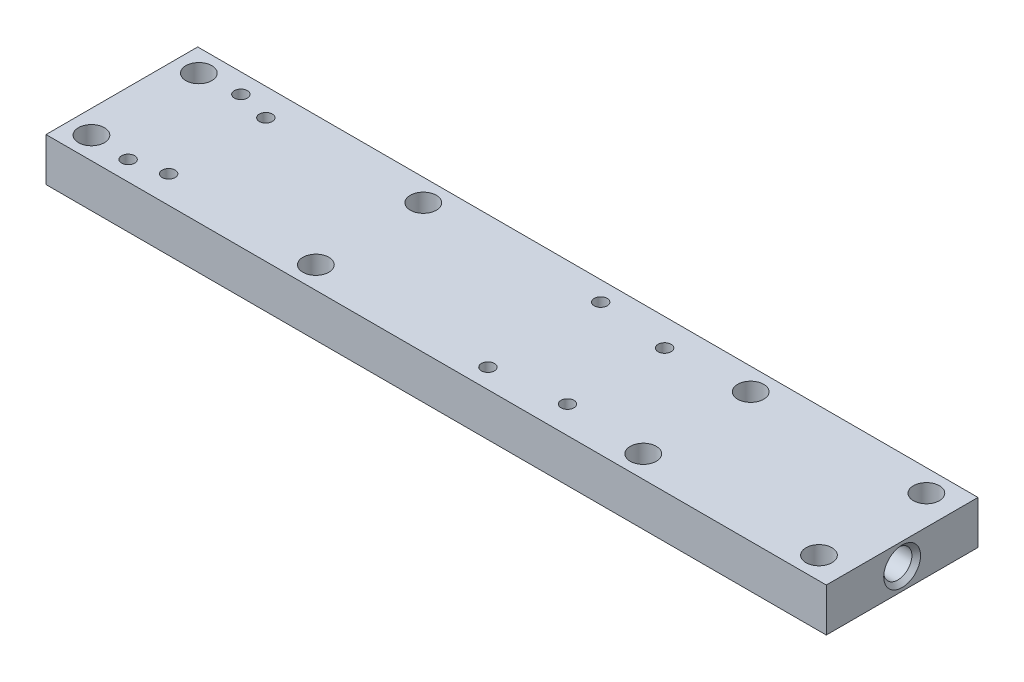
ISO-10303-21;
HEADER;
FILE_DESCRIPTION(('STEP AP214'),'2;1');
FILE_NAME('part.step','',(''),(''),'','','');
FILE_SCHEMA(('AUTOMOTIVE_DESIGN { 1 0 10303 214 1 1 1 1 }'));
ENDSEC;
DATA;
#1=APPLICATION_CONTEXT('core data for automotive mechanical design processes');
#2=APPLICATION_PROTOCOL_DEFINITION('international standard','automotive_design',2000,#1);
#3=PRODUCT_CONTEXT('',#1,'mechanical');
#4=PRODUCT('Part','Part','',(#3));
#5=PRODUCT_RELATED_PRODUCT_CATEGORY('part','',(#4));
#6=PRODUCT_DEFINITION_FORMATION('','',#4);
#7=PRODUCT_DEFINITION_CONTEXT('part definition',#1,'design');
#8=PRODUCT_DEFINITION('design','',#6,#7);
#9=PRODUCT_DEFINITION_SHAPE('','',#8);
#10=(LENGTH_UNIT() NAMED_UNIT(*) SI_UNIT(.MILLI.,.METRE.));
#11=(NAMED_UNIT(*) PLANE_ANGLE_UNIT() SI_UNIT($,.RADIAN.));
#12=(NAMED_UNIT(*) SI_UNIT($,.STERADIAN.) SOLID_ANGLE_UNIT());
#13=UNCERTAINTY_MEASURE_WITH_UNIT(LENGTH_MEASURE(1.E-05),#10,'distance_accuracy_value','');
#14=(GEOMETRIC_REPRESENTATION_CONTEXT(3) GLOBAL_UNCERTAINTY_ASSIGNED_CONTEXT((#13)) GLOBAL_UNIT_ASSIGNED_CONTEXT((#10,
#11,#12)) REPRESENTATION_CONTEXT('',''));
#15=CARTESIAN_POINT('',(0.,0.,0.));
#16=DIRECTION('',(0.,0.,1.));
#17=DIRECTION('',(1.,0.,0.));
#18=AXIS2_PLACEMENT_3D('',#15,#16,#17);
#19=CARTESIAN_POINT('',(-90.,5.,-17.5));
#20=DIRECTION('',(1.,0.,0.));
#21=DIRECTION('',(0.,0.,-1.));
#22=AXIS2_PLACEMENT_3D('',#19,#20,#21);
#23=PLANE('',#22);
#24=CARTESIAN_POINT('',(-90.,0.,0.));
#25=DIRECTION('',(1.,0.,0.));
#26=DIRECTION('',(0.,0.,-1.));
#27=AXIS2_PLACEMENT_3D('',#24,#25,#26);
#28=CIRCLE('',#27,4.24999999999989);
#29=CARTESIAN_POINT('',(-90.,0.,-4.24999999999989));
#30=VERTEX_POINT('',#29);
#31=EDGE_CURVE('E58',#30,#30,#28,.T.);
#32=ORIENTED_EDGE('',*,*,#31,.T.);
#33=EDGE_LOOP('',(#32));
#34=FACE_BOUND('',#33,.T.);
#35=DIRECTION('',(0.,0.,1.));
#36=VECTOR('',#35,1.);
#37=CARTESIAN_POINT('',(-90.,-5.,-17.5));
#38=LINE('',#37,#36);
#39=CARTESIAN_POINT('',(-90.,-5.,-17.5));
#40=VERTEX_POINT('',#39);
#41=CARTESIAN_POINT('',(-90.,-5.,17.5));
#42=VERTEX_POINT('',#41);
#43=EDGE_CURVE('E122',#40,#42,#38,.T.);
#44=ORIENTED_EDGE('',*,*,#43,.T.);
#45=DIRECTION('',(0.,-1.,0.));
#46=VECTOR('',#45,1.);
#47=CARTESIAN_POINT('',(-90.,5.,17.5));
#48=LINE('',#47,#46);
#49=CARTESIAN_POINT('',(-90.,5.,17.5));
#50=VERTEX_POINT('',#49);
#51=EDGE_CURVE('E111',#50,#42,#48,.T.);
#52=ORIENTED_EDGE('',*,*,#51,.F.);
#53=DIRECTION('',(0.,0.,1.));
#54=VECTOR('',#53,1.);
#55=CARTESIAN_POINT('',(-90.,5.,-17.5));
#56=LINE('',#55,#54);
#57=CARTESIAN_POINT('',(-90.,5.,-17.5));
#58=VERTEX_POINT('',#57);
#59=EDGE_CURVE('E103',#58,#50,#56,.T.);
#60=ORIENTED_EDGE('',*,*,#59,.F.);
#61=DIRECTION('',(0.,-1.,0.));
#62=VECTOR('',#61,1.);
#63=CARTESIAN_POINT('',(-90.,5.,-17.5));
#64=LINE('',#63,#62);
#65=EDGE_CURVE('E118',#58,#40,#64,.T.);
#66=ORIENTED_EDGE('',*,*,#65,.T.);
#67=EDGE_LOOP('',(#44,#52,#60,#66));
#68=FACE_BOUND('',#67,.T.);
#69=ADVANCED_FACE('F46',(#34,#68),#23,.F.);
#70=CARTESIAN_POINT('',(-90.,5.,17.5));
#71=DIRECTION('',(0.,0.,-1.));
#72=DIRECTION('',(-1.,0.,0.));
#73=AXIS2_PLACEMENT_3D('',#70,#71,#72);
#74=PLANE('',#73);
#75=DIRECTION('',(1.,0.,0.));
#76=VECTOR('',#75,1.);
#77=CARTESIAN_POINT('',(-90.,-5.,17.5));
#78=LINE('',#77,#76);
#79=CARTESIAN_POINT('',(90.,-5.,17.5));
#80=VERTEX_POINT('',#79);
#81=EDGE_CURVE('E109',#42,#80,#78,.T.);
#82=ORIENTED_EDGE('',*,*,#81,.T.);
#83=DIRECTION('',(0.,-1.,0.));
#84=VECTOR('',#83,1.);
#85=CARTESIAN_POINT('',(90.,5.,17.5));
#86=LINE('',#85,#84);
#87=CARTESIAN_POINT('',(90.,5.,17.5));
#88=VERTEX_POINT('',#87);
#89=EDGE_CURVE('E107',#88,#80,#86,.T.);
#90=ORIENTED_EDGE('',*,*,#89,.F.);
#91=DIRECTION('',(1.,0.,0.));
#92=VECTOR('',#91,1.);
#93=CARTESIAN_POINT('',(-90.,5.,17.5));
#94=LINE('',#93,#92);
#95=EDGE_CURVE('E98',#50,#88,#94,.T.);
#96=ORIENTED_EDGE('',*,*,#95,.F.);
#97=ORIENTED_EDGE('',*,*,#51,.T.);
#98=EDGE_LOOP('',(#82,#90,#96,#97));
#99=FACE_BOUND('',#98,.T.);
#100=ADVANCED_FACE('F108',(#99),#74,.F.);
#101=CARTESIAN_POINT('',(90.,5.,-17.5));
#102=DIRECTION('',(-1.,0.,0.));
#103=DIRECTION('',(0.,0.,1.));
#104=AXIS2_PLACEMENT_3D('',#101,#102,#103);
#105=PLANE('',#104);
#106=CARTESIAN_POINT('',(90.,0.,0.));
#107=DIRECTION('',(-1.,0.,0.));
#108=DIRECTION('',(0.,0.,1.));
#109=AXIS2_PLACEMENT_3D('',#106,#107,#108);
#110=CIRCLE('',#109,4.25000000000011);
#111=CARTESIAN_POINT('',(90.,0.,4.25000000000011));
#112=VERTEX_POINT('',#111);
#113=EDGE_CURVE('E143',#112,#112,#110,.T.);
#114=ORIENTED_EDGE('',*,*,#113,.T.);
#115=EDGE_LOOP('',(#114));
#116=FACE_BOUND('',#115,.T.);
#117=DIRECTION('',(0.,0.,-1.));
#118=VECTOR('',#117,1.);
#119=CARTESIAN_POINT('',(90.,-5.,-17.5));
#120=LINE('',#119,#118);
#121=CARTESIAN_POINT('',(90.,-5.,-17.5));
#122=VERTEX_POINT('',#121);
#123=EDGE_CURVE('E84',#80,#122,#120,.T.);
#124=ORIENTED_EDGE('',*,*,#123,.T.);
#125=DIRECTION('',(0.,-1.,0.));
#126=VECTOR('',#125,1.);
#127=CARTESIAN_POINT('',(90.,5.,-17.5));
#128=LINE('',#127,#126);
#129=CARTESIAN_POINT('',(90.,5.,-17.5));
#130=VERTEX_POINT('',#129);
#131=EDGE_CURVE('E112',#130,#122,#128,.T.);
#132=ORIENTED_EDGE('',*,*,#131,.F.);
#133=DIRECTION('',(0.,0.,-1.));
#134=VECTOR('',#133,1.);
#135=CARTESIAN_POINT('',(90.,5.,-17.5));
#136=LINE('',#135,#134);
#137=EDGE_CURVE('E101',#88,#130,#136,.T.);
#138=ORIENTED_EDGE('',*,*,#137,.F.);
#139=ORIENTED_EDGE('',*,*,#89,.T.);
#140=EDGE_LOOP('',(#124,#132,#138,#139));
#141=FACE_BOUND('',#140,.T.);
#142=ADVANCED_FACE('F114',(#116,#141),#105,.F.);
#143=CARTESIAN_POINT('',(-90.,5.,-17.5));
#144=DIRECTION('',(0.,0.,1.));
#145=DIRECTION('',(1.,0.,0.));
#146=AXIS2_PLACEMENT_3D('',#143,#144,#145);
#147=PLANE('',#146);
#148=DIRECTION('',(-1.,0.,0.));
#149=VECTOR('',#148,1.);
#150=CARTESIAN_POINT('',(-90.,-5.,-17.5));
#151=LINE('',#150,#149);
#152=EDGE_CURVE('E90',#122,#40,#151,.T.);
#153=ORIENTED_EDGE('',*,*,#152,.T.);
#154=ORIENTED_EDGE('',*,*,#65,.F.);
#155=DIRECTION('',(-1.,0.,0.));
#156=VECTOR('',#155,1.);
#157=CARTESIAN_POINT('',(-90.,5.,-17.5));
#158=LINE('',#157,#156);
#159=EDGE_CURVE('E67',#130,#58,#158,.T.);
#160=ORIENTED_EDGE('',*,*,#159,.F.);
#161=ORIENTED_EDGE('',*,*,#131,.T.);
#162=EDGE_LOOP('',(#153,#154,#160,#161));
#163=FACE_BOUND('',#162,.T.);
#164=ADVANCED_FACE('F289',(#163),#147,.F.);
#165=CARTESIAN_POINT('',(0.,5.,0.));
#166=DIRECTION('',(0.,1.,0.));
#167=DIRECTION('',(0.,0.,1.));
#168=AXIS2_PLACEMENT_3D('',#165,#166,#167);
#169=PLANE('',#168);
#170=CARTESIAN_POINT('',(42.676245091734,5.,12.3901503853325));
#171=DIRECTION('',(0.,1.,0.));
#172=DIRECTION('',(0.,0.,1.));
#173=AXIS2_PLACEMENT_3D('',#170,#171,#172);
#174=CIRCLE('',#173,3.);
#175=CARTESIAN_POINT('',(42.676245091734,5.,15.3901503853325));
#176=VERTEX_POINT('',#175);
#177=EDGE_CURVE('E248',#176,#176,#174,.T.);
#178=ORIENTED_EDGE('',*,*,#177,.F.);
#179=EDGE_LOOP('',(#178));
#180=FACE_BOUND('',#179,.T.);
#181=CARTESIAN_POINT('',(83.2040273781782,5.,12.3901503853325));
#182=DIRECTION('',(0.,1.,0.));
#183=DIRECTION('',(0.,0.,1.));
#184=AXIS2_PLACEMENT_3D('',#181,#182,#183);
#185=CIRCLE('',#184,3.00000000000001);
#186=CARTESIAN_POINT('',(83.2040273781782,5.,15.3901503853325));
#187=VERTEX_POINT('',#186);
#188=EDGE_CURVE('E233',#187,#187,#185,.T.);
#189=ORIENTED_EDGE('',*,*,#188,.F.);
#190=EDGE_LOOP('',(#189));
#191=FACE_BOUND('',#190,.T.);
#192=CARTESIAN_POINT('',(83.2040273781782,5.,-12.3901503853325));
#193=DIRECTION('',(0.,1.,0.));
#194=DIRECTION('',(0.,0.,1.));
#195=AXIS2_PLACEMENT_3D('',#192,#193,#194);
#196=CIRCLE('',#195,3.00000000000001);
#197=CARTESIAN_POINT('',(83.2040273781782,5.,-9.39015038533253));
#198=VERTEX_POINT('',#197);
#199=EDGE_CURVE('E232',#198,#198,#196,.T.);
#200=ORIENTED_EDGE('',*,*,#199,.F.);
#201=EDGE_LOOP('',(#200));
#202=FACE_BOUND('',#201,.T.);
#203=CARTESIAN_POINT('',(-84.6323525907007,5.,12.3901503853325));
#204=DIRECTION('',(0.,1.,0.));
#205=DIRECTION('',(0.,0.,1.));
#206=AXIS2_PLACEMENT_3D('',#203,#204,#205);
#207=CIRCLE('',#206,3.00000000000001);
#208=CARTESIAN_POINT('',(-84.6323525907007,5.,15.3901503853325));
#209=VERTEX_POINT('',#208);
#210=EDGE_CURVE('E224',#209,#209,#207,.T.);
#211=ORIENTED_EDGE('',*,*,#210,.F.);
#212=EDGE_LOOP('',(#211));
#213=FACE_BOUND('',#212,.T.);
#214=CARTESIAN_POINT('',(42.676245091734,5.,-12.3901503853325));
#215=DIRECTION('',(0.,1.,0.));
#216=DIRECTION('',(0.,0.,1.));
#217=AXIS2_PLACEMENT_3D('',#214,#215,#216);
#218=CIRCLE('',#217,3.);
#219=CARTESIAN_POINT('',(42.676245091734,5.,-9.39015038533253));
#220=VERTEX_POINT('',#219);
#221=EDGE_CURVE('E249',#220,#220,#218,.T.);
#222=ORIENTED_EDGE('',*,*,#221,.F.);
#223=EDGE_LOOP('',(#222));
#224=FACE_BOUND('',#223,.T.);
#225=CARTESIAN_POINT('',(-32.8527276642916,5.,-12.3901503853325));
#226=DIRECTION('',(0.,1.,0.));
#227=DIRECTION('',(0.,0.,1.));
#228=AXIS2_PLACEMENT_3D('',#225,#226,#227);
#229=CIRCLE('',#228,3.);
#230=CARTESIAN_POINT('',(-32.8527276642916,5.,-9.39015038533253));
#231=VERTEX_POINT('',#230);
#232=EDGE_CURVE('E272',#231,#231,#229,.T.);
#233=ORIENTED_EDGE('',*,*,#232,.F.);
#234=EDGE_LOOP('',(#233));
#235=FACE_BOUND('',#234,.T.);
#236=CARTESIAN_POINT('',(-32.8527276642916,5.,12.3901503853325));
#237=DIRECTION('',(0.,1.,0.));
#238=DIRECTION('',(0.,0.,1.));
#239=AXIS2_PLACEMENT_3D('',#236,#237,#238);
#240=CIRCLE('',#239,3.);
#241=CARTESIAN_POINT('',(-32.8527276642916,5.,15.3901503853325));
#242=VERTEX_POINT('',#241);
#243=EDGE_CURVE('E264',#242,#242,#240,.T.);
#244=ORIENTED_EDGE('',*,*,#243,.F.);
#245=EDGE_LOOP('',(#244));
#246=FACE_BOUND('',#245,.T.);
#247=CARTESIAN_POINT('',(-84.6323525907007,5.,-12.3901503853325));
#248=DIRECTION('',(0.,1.,0.));
#249=DIRECTION('',(0.,0.,1.));
#250=AXIS2_PLACEMENT_3D('',#247,#248,#249);
#251=CIRCLE('',#250,3.00000000000001);
#252=CARTESIAN_POINT('',(-84.6323525907007,5.,-9.39015038533253));
#253=VERTEX_POINT('',#252);
#254=EDGE_CURVE('E220',#253,#253,#251,.T.);
#255=ORIENTED_EDGE('',*,*,#254,.F.);
#256=EDGE_LOOP('',(#255));
#257=FACE_BOUND('',#256,.T.);
#258=CARTESIAN_POINT('',(7.44740285438521,5.,-13.));
#259=DIRECTION('',(0.,1.,0.));
#260=DIRECTION('',(0.,0.,1.));
#261=AXIS2_PLACEMENT_3D('',#258,#259,#260);
#262=CIRCLE('',#261,1.5);
#263=CARTESIAN_POINT('',(7.44740285438521,5.,-11.5));
#264=VERTEX_POINT('',#263);
#265=EDGE_CURVE('E208',#264,#264,#262,.T.);
#266=ORIENTED_EDGE('',*,*,#265,.F.);
#267=EDGE_LOOP('',(#266));
#268=FACE_BOUND('',#267,.T.);
#269=CARTESIAN_POINT('',(7.44740285438521,5.,13.));
#270=DIRECTION('',(0.,1.,0.));
#271=DIRECTION('',(0.,0.,1.));
#272=AXIS2_PLACEMENT_3D('',#269,#270,#271);
#273=CIRCLE('',#272,1.5);
#274=CARTESIAN_POINT('',(7.44740285438521,5.,14.5));
#275=VERTEX_POINT('',#274);
#276=EDGE_CURVE('E212',#275,#275,#273,.T.);
#277=ORIENTED_EDGE('',*,*,#276,.F.);
#278=EDGE_LOOP('',(#277));
#279=FACE_BOUND('',#278,.T.);
#280=CARTESIAN_POINT('',(-75.5525971456148,5.,13.));
#281=DIRECTION('',(0.,1.,0.));
#282=DIRECTION('',(0.,0.,1.));
#283=AXIS2_PLACEMENT_3D('',#280,#281,#282);
#284=CIRCLE('',#283,1.5);
#285=CARTESIAN_POINT('',(-75.5525971456148,5.,14.5));
#286=VERTEX_POINT('',#285);
#287=EDGE_CURVE('E207',#286,#286,#284,.T.);
#288=ORIENTED_EDGE('',*,*,#287,.F.);
#289=EDGE_LOOP('',(#288));
#290=FACE_BOUND('',#289,.T.);
#291=CARTESIAN_POINT('',(-75.5525971456148,5.,-13.));
#292=DIRECTION('',(0.,1.,0.));
#293=DIRECTION('',(0.,0.,1.));
#294=AXIS2_PLACEMENT_3D('',#291,#292,#293);
#295=CIRCLE('',#294,1.5);
#296=CARTESIAN_POINT('',(-75.5525971456148,5.,-11.5));
#297=VERTEX_POINT('',#296);
#298=EDGE_CURVE('E155',#297,#297,#295,.T.);
#299=ORIENTED_EDGE('',*,*,#298,.F.);
#300=EDGE_LOOP('',(#299));
#301=FACE_BOUND('',#300,.T.);
#302=CARTESIAN_POINT('',(24.,5.,11.2));
#303=DIRECTION('',(0.,1.,0.));
#304=DIRECTION('',(0.,0.,1.));
#305=AXIS2_PLACEMENT_3D('',#302,#303,#304);
#306=CIRCLE('',#305,1.5);
#307=CARTESIAN_POINT('',(24.,5.,12.7));
#308=VERTEX_POINT('',#307);
#309=EDGE_CURVE('E170',#308,#308,#306,.T.);
#310=ORIENTED_EDGE('',*,*,#309,.F.);
#311=EDGE_LOOP('',(#310));
#312=FACE_BOUND('',#311,.T.);
#313=CARTESIAN_POINT('',(24.,5.,-11.2));
#314=DIRECTION('',(0.,1.,0.));
#315=DIRECTION('',(0.,0.,1.));
#316=AXIS2_PLACEMENT_3D('',#313,#314,#315);
#317=CIRCLE('',#316,1.5);
#318=CARTESIAN_POINT('',(24.,5.,-9.7));
#319=VERTEX_POINT('',#318);
#320=EDGE_CURVE('E195',#319,#319,#317,.T.);
#321=ORIENTED_EDGE('',*,*,#320,.F.);
#322=EDGE_LOOP('',(#321));
#323=FACE_BOUND('',#322,.T.);
#324=CARTESIAN_POINT('',(-68.,5.,-11.2));
#325=DIRECTION('',(0.,1.,0.));
#326=DIRECTION('',(0.,0.,1.));
#327=AXIS2_PLACEMENT_3D('',#324,#325,#326);
#328=CIRCLE('',#327,1.5);
#329=CARTESIAN_POINT('',(-68.,5.,-9.7));
#330=VERTEX_POINT('',#329);
#331=EDGE_CURVE('E186',#330,#330,#328,.T.);
#332=ORIENTED_EDGE('',*,*,#331,.F.);
#333=EDGE_LOOP('',(#332));
#334=FACE_BOUND('',#333,.T.);
#335=CARTESIAN_POINT('',(-68.,5.,11.2));
#336=DIRECTION('',(0.,1.,0.));
#337=DIRECTION('',(0.,0.,1.));
#338=AXIS2_PLACEMENT_3D('',#335,#336,#337);
#339=CIRCLE('',#338,1.5);
#340=CARTESIAN_POINT('',(-68.,5.,12.7));
#341=VERTEX_POINT('',#340);
#342=EDGE_CURVE('E183',#341,#341,#339,.T.);
#343=ORIENTED_EDGE('',*,*,#342,.F.);
#344=EDGE_LOOP('',(#343));
#345=FACE_BOUND('',#344,.T.);
#346=ORIENTED_EDGE('',*,*,#59,.T.);
#347=ORIENTED_EDGE('',*,*,#95,.T.);
#348=ORIENTED_EDGE('',*,*,#137,.T.);
#349=ORIENTED_EDGE('',*,*,#159,.T.);
#350=EDGE_LOOP('',(#346,#347,#348,#349));
#351=FACE_BOUND('',#350,.T.);
#352=ADVANCED_FACE('F99',(#180,#191,#202,#213,#224,#235,#246,#257,#268,#279,#290,#301,#312,#323,
#334,#345,#351),#169,.T.);
#353=CARTESIAN_POINT('',(0.,-5.,0.));
#354=DIRECTION('',(0.,1.,0.));
#355=DIRECTION('',(0.,0.,1.));
#356=AXIS2_PLACEMENT_3D('',#353,#354,#355);
#357=PLANE('',#356);
#358=CARTESIAN_POINT('',(42.676245091734,-5.,12.3901503853325));
#359=DIRECTION('',(0.,1.,0.));
#360=DIRECTION('',(0.,0.,1.));
#361=AXIS2_PLACEMENT_3D('',#358,#359,#360);
#362=CIRCLE('',#361,3.);
#363=CARTESIAN_POINT('',(42.676245091734,-5.,15.3901503853325));
#364=VERTEX_POINT('',#363);
#365=EDGE_CURVE('E244',#364,#364,#362,.T.);
#366=ORIENTED_EDGE('',*,*,#365,.T.);
#367=EDGE_LOOP('',(#366));
#368=FACE_BOUND('',#367,.T.);
#369=CARTESIAN_POINT('',(83.2040273781782,-5.,12.3901503853325));
#370=DIRECTION('',(0.,1.,0.));
#371=DIRECTION('',(0.,0.,1.));
#372=AXIS2_PLACEMENT_3D('',#369,#370,#371);
#373=CIRCLE('',#372,3.00000000000001);
#374=CARTESIAN_POINT('',(83.2040273781782,-5.,15.3901503853325));
#375=VERTEX_POINT('',#374);
#376=EDGE_CURVE('E253',#375,#375,#373,.T.);
#377=ORIENTED_EDGE('',*,*,#376,.T.);
#378=EDGE_LOOP('',(#377));
#379=FACE_BOUND('',#378,.T.);
#380=CARTESIAN_POINT('',(83.2040273781782,-5.,-12.3901503853325));
#381=DIRECTION('',(0.,1.,0.));
#382=DIRECTION('',(0.,0.,1.));
#383=AXIS2_PLACEMENT_3D('',#380,#381,#382);
#384=CIRCLE('',#383,3.00000000000001);
#385=CARTESIAN_POINT('',(83.2040273781782,-5.,-9.39015038533253));
#386=VERTEX_POINT('',#385);
#387=EDGE_CURVE('E228',#386,#386,#384,.T.);
#388=ORIENTED_EDGE('',*,*,#387,.T.);
#389=EDGE_LOOP('',(#388));
#390=FACE_BOUND('',#389,.T.);
#391=CARTESIAN_POINT('',(-84.6323525907007,-5.,12.3901503853325));
#392=DIRECTION('',(0.,1.,0.));
#393=DIRECTION('',(0.,0.,1.));
#394=AXIS2_PLACEMENT_3D('',#391,#392,#393);
#395=CIRCLE('',#394,3.00000000000001);
#396=CARTESIAN_POINT('',(-84.6323525907007,-5.,15.3901503853325));
#397=VERTEX_POINT('',#396);
#398=EDGE_CURVE('E237',#397,#397,#395,.T.);
#399=ORIENTED_EDGE('',*,*,#398,.T.);
#400=EDGE_LOOP('',(#399));
#401=FACE_BOUND('',#400,.T.);
#402=CARTESIAN_POINT('',(42.676245091734,-5.,-12.3901503853325));
#403=DIRECTION('',(0.,1.,0.));
#404=DIRECTION('',(0.,0.,1.));
#405=AXIS2_PLACEMENT_3D('',#402,#403,#404);
#406=CIRCLE('',#405,3.);
#407=CARTESIAN_POINT('',(42.676245091734,-5.,-9.39015038533253));
#408=VERTEX_POINT('',#407);
#409=EDGE_CURVE('E276',#408,#408,#406,.T.);
#410=ORIENTED_EDGE('',*,*,#409,.T.);
#411=EDGE_LOOP('',(#410));
#412=FACE_BOUND('',#411,.T.);
#413=CARTESIAN_POINT('',(-32.8527276642916,-5.,-12.3901503853325));
#414=DIRECTION('',(0.,1.,0.));
#415=DIRECTION('',(0.,0.,1.));
#416=AXIS2_PLACEMENT_3D('',#413,#414,#415);
#417=CIRCLE('',#416,3.);
#418=CARTESIAN_POINT('',(-32.8527276642916,-5.,-9.39015038533253));
#419=VERTEX_POINT('',#418);
#420=EDGE_CURVE('E268',#419,#419,#417,.T.);
#421=ORIENTED_EDGE('',*,*,#420,.T.);
#422=EDGE_LOOP('',(#421));
#423=FACE_BOUND('',#422,.T.);
#424=CARTESIAN_POINT('',(-32.8527276642916,-5.,12.3901503853325));
#425=DIRECTION('',(0.,1.,0.));
#426=DIRECTION('',(0.,0.,1.));
#427=AXIS2_PLACEMENT_3D('',#424,#425,#426);
#428=CIRCLE('',#427,3.);
#429=CARTESIAN_POINT('',(-32.8527276642916,-5.,15.3901503853325));
#430=VERTEX_POINT('',#429);
#431=EDGE_CURVE('E260',#430,#430,#428,.T.);
#432=ORIENTED_EDGE('',*,*,#431,.T.);
#433=EDGE_LOOP('',(#432));
#434=FACE_BOUND('',#433,.T.);
#435=CARTESIAN_POINT('',(-84.6323525907007,-5.,-12.3901503853325));
#436=DIRECTION('',(0.,1.,0.));
#437=DIRECTION('',(0.,0.,1.));
#438=AXIS2_PLACEMENT_3D('',#435,#436,#437);
#439=CIRCLE('',#438,3.00000000000001);
#440=CARTESIAN_POINT('',(-84.6323525907007,-5.,-9.39015038533253));
#441=VERTEX_POINT('',#440);
#442=EDGE_CURVE('E213',#441,#441,#439,.T.);
#443=ORIENTED_EDGE('',*,*,#442,.T.);
#444=EDGE_LOOP('',(#443));
#445=FACE_BOUND('',#444,.T.);
#446=CARTESIAN_POINT('',(7.44740285438521,-5.,-13.));
#447=DIRECTION('',(0.,1.,0.));
#448=DIRECTION('',(0.,0.,1.));
#449=AXIS2_PLACEMENT_3D('',#446,#447,#448);
#450=CIRCLE('',#449,1.5);
#451=CARTESIAN_POINT('',(7.44740285438521,-5.,-11.5));
#452=VERTEX_POINT('',#451);
#453=EDGE_CURVE('E51',#452,#452,#450,.T.);
#454=ORIENTED_EDGE('',*,*,#453,.T.);
#455=EDGE_LOOP('',(#454));
#456=FACE_BOUND('',#455,.T.);
#457=CARTESIAN_POINT('',(7.44740285438521,-5.,13.));
#458=DIRECTION('',(0.,1.,0.));
#459=DIRECTION('',(0.,0.,1.));
#460=AXIS2_PLACEMENT_3D('',#457,#458,#459);
#461=CIRCLE('',#460,1.5);
#462=CARTESIAN_POINT('',(7.44740285438521,-5.,14.5));
#463=VERTEX_POINT('',#462);
#464=EDGE_CURVE('E158',#463,#463,#461,.T.);
#465=ORIENTED_EDGE('',*,*,#464,.T.);
#466=EDGE_LOOP('',(#465));
#467=FACE_BOUND('',#466,.T.);
#468=CARTESIAN_POINT('',(-75.5525971456148,-5.,13.));
#469=DIRECTION('',(0.,1.,0.));
#470=DIRECTION('',(0.,0.,1.));
#471=AXIS2_PLACEMENT_3D('',#468,#469,#470);
#472=CIRCLE('',#471,1.5);
#473=CARTESIAN_POINT('',(-75.5525971456148,-5.,14.5));
#474=VERTEX_POINT('',#473);
#475=EDGE_CURVE('E154',#474,#474,#472,.T.);
#476=ORIENTED_EDGE('',*,*,#475,.T.);
#477=EDGE_LOOP('',(#476));
#478=FACE_BOUND('',#477,.T.);
#479=CARTESIAN_POINT('',(-75.5525971456148,-5.,-13.));
#480=DIRECTION('',(0.,1.,0.));
#481=DIRECTION('',(0.,0.,1.));
#482=AXIS2_PLACEMENT_3D('',#479,#480,#481);
#483=CIRCLE('',#482,1.5);
#484=CARTESIAN_POINT('',(-75.5525971456148,-5.,-11.5));
#485=VERTEX_POINT('',#484);
#486=EDGE_CURVE('E150',#485,#485,#483,.T.);
#487=ORIENTED_EDGE('',*,*,#486,.T.);
#488=EDGE_LOOP('',(#487));
#489=FACE_BOUND('',#488,.T.);
#490=CARTESIAN_POINT('',(24.,-5.,11.2));
#491=DIRECTION('',(0.,1.,0.));
#492=DIRECTION('',(0.,0.,1.));
#493=AXIS2_PLACEMENT_3D('',#490,#491,#492);
#494=CIRCLE('',#493,1.5);
#495=CARTESIAN_POINT('',(24.,-5.,12.7));
#496=VERTEX_POINT('',#495);
#497=EDGE_CURVE('E165',#496,#496,#494,.T.);
#498=ORIENTED_EDGE('',*,*,#497,.T.);
#499=EDGE_LOOP('',(#498));
#500=FACE_BOUND('',#499,.T.);
#501=CARTESIAN_POINT('',(24.,-5.,-11.2));
#502=DIRECTION('',(0.,1.,0.));
#503=DIRECTION('',(0.,0.,1.));
#504=AXIS2_PLACEMENT_3D('',#501,#502,#503);
#505=CIRCLE('',#504,1.5);
#506=CARTESIAN_POINT('',(24.,-5.,-9.7));
#507=VERTEX_POINT('',#506);
#508=EDGE_CURVE('E176',#507,#507,#505,.T.);
#509=ORIENTED_EDGE('',*,*,#508,.T.);
#510=EDGE_LOOP('',(#509));
#511=FACE_BOUND('',#510,.T.);
#512=CARTESIAN_POINT('',(-68.,-5.,-11.2));
#513=DIRECTION('',(0.,1.,0.));
#514=DIRECTION('',(0.,0.,1.));
#515=AXIS2_PLACEMENT_3D('',#512,#513,#514);
#516=CIRCLE('',#515,1.5);
#517=CARTESIAN_POINT('',(-68.,-5.,-9.7));
#518=VERTEX_POINT('',#517);
#519=EDGE_CURVE('E191',#518,#518,#516,.T.);
#520=ORIENTED_EDGE('',*,*,#519,.T.);
#521=EDGE_LOOP('',(#520));
#522=FACE_BOUND('',#521,.T.);
#523=CARTESIAN_POINT('',(-68.,-5.,11.2));
#524=DIRECTION('',(0.,1.,0.));
#525=DIRECTION('',(0.,0.,1.));
#526=AXIS2_PLACEMENT_3D('',#523,#524,#525);
#527=CIRCLE('',#526,1.5);
#528=CARTESIAN_POINT('',(-68.,-5.,12.7));
#529=VERTEX_POINT('',#528);
#530=EDGE_CURVE('E126',#529,#529,#527,.T.);
#531=ORIENTED_EDGE('',*,*,#530,.T.);
#532=EDGE_LOOP('',(#531));
#533=FACE_BOUND('',#532,.T.);
#534=ORIENTED_EDGE('',*,*,#43,.F.);
#535=ORIENTED_EDGE('',*,*,#152,.F.);
#536=ORIENTED_EDGE('',*,*,#123,.F.);
#537=ORIENTED_EDGE('',*,*,#81,.F.);
#538=EDGE_LOOP('',(#534,#535,#536,#537));
#539=FACE_BOUND('',#538,.T.);
#540=ADVANCED_FACE('F288',(#368,#379,#390,#401,#412,#423,#434,#445,#456,#467,#478,#489,#500,
#511,#522,#533,#539),#357,.F.);
#541=CARTESIAN_POINT('',(-90.,0.,0.));
#542=DIRECTION('',(1.,0.,0.));
#543=DIRECTION('',(0.,0.,-1.));
#544=AXIS2_PLACEMENT_3D('',#541,#542,#543);
#545=CYLINDRICAL_SURFACE('',#544,3.25);
#546=CARTESIAN_POINT('',(-89.0000000000001,0.,0.));
#547=DIRECTION('',(1.,0.,0.));
#548=DIRECTION('',(0.,0.,-1.));
#549=AXIS2_PLACEMENT_3D('',#546,#547,#548);
#550=CIRCLE('',#549,3.25);
#551=CARTESIAN_POINT('',(-89.0000000000001,0.,-3.25));
#552=VERTEX_POINT('',#551);
#553=EDGE_CURVE('E11',#552,#552,#550,.F.);
#554=CARTESIAN_POINT('',(88.9999999999999,0.,0.));
#555=DIRECTION('',(-1.,0.,0.));
#556=DIRECTION('',(0.,0.,1.));
#557=AXIS2_PLACEMENT_3D('',#554,#555,#556);
#558=CIRCLE('',#557,3.25);
#559=CARTESIAN_POINT('',(88.9999999999999,0.,-3.25));
#560=VERTEX_POINT('',#559);
#561=EDGE_CURVE('E139',#560,#560,#558,.F.);
#562=CARTESIAN_POINT('',(-89.0000000000001,0.,-3.25));
#563=CARTESIAN_POINT('',(-87.1458333333335,0.,-3.25));
#564=CARTESIAN_POINT('',(-85.2916666666668,0.,-3.25));
#565=CARTESIAN_POINT('',(-81.5833333333335,0.,-3.25));
#566=CARTESIAN_POINT('',(-79.7291666666668,0.,-3.25));
#567=CARTESIAN_POINT('',(-76.0208333333335,0.,-3.25));
#568=CARTESIAN_POINT('',(-74.1666666666668,0.,-3.25));
#569=CARTESIAN_POINT('',(-70.4583333333335,0.,-3.25));
#570=CARTESIAN_POINT('',(-68.6041666666668,0.,-3.25));
#571=CARTESIAN_POINT('',(-64.8958333333334,0.,-3.25));
#572=CARTESIAN_POINT('',(-63.0416666666668,0.,-3.25));
#573=CARTESIAN_POINT('',(-59.3333333333335,0.,-3.25));
#574=CARTESIAN_POINT('',(-57.4791666666668,0.,-3.25));
#575=CARTESIAN_POINT('',(-53.7708333333335,0.,-3.25));
#576=CARTESIAN_POINT('',(-51.9166666666668,0.,-3.25));
#577=CARTESIAN_POINT('',(-48.2083333333334,0.,-3.25));
#578=CARTESIAN_POINT('',(-46.3541666666668,0.,-3.25));
#579=CARTESIAN_POINT('',(-42.6458333333334,0.,-3.25));
#580=CARTESIAN_POINT('',(-40.7916666666668,0.,-3.25));
#581=CARTESIAN_POINT('',(-37.0833333333334,0.,-3.25));
#582=CARTESIAN_POINT('',(-35.2291666666668,0.,-3.25));
#583=CARTESIAN_POINT('',(-31.5208333333334,0.,-3.25));
#584=CARTESIAN_POINT('',(-29.6666666666668,0.,-3.25));
#585=CARTESIAN_POINT('',(-25.9583333333334,0.,-3.25));
#586=CARTESIAN_POINT('',(-24.1041666666668,0.,-3.25));
#587=CARTESIAN_POINT('',(-20.3958333333334,0.,-3.25));
#588=CARTESIAN_POINT('',(-18.5416666666668,0.,-3.25));
#589=CARTESIAN_POINT('',(-14.8333333333334,0.,-3.25));
#590=CARTESIAN_POINT('',(-12.9791666666668,0.,-3.25));
#591=CARTESIAN_POINT('',(-9.27083333333344,0.,-3.25));
#592=CARTESIAN_POINT('',(-7.41666666666677,0.,-3.25));
#593=CARTESIAN_POINT('',(-3.70833333333343,0.,-3.25));
#594=CARTESIAN_POINT('',(-1.85416666666676,0.,-3.25));
#595=CARTESIAN_POINT('',(1.85416666666657,0.,-3.25));
#596=CARTESIAN_POINT('',(3.70833333333323,0.,-3.25));
#597=CARTESIAN_POINT('',(7.41666666666657,0.,-3.25));
#598=CARTESIAN_POINT('',(9.27083333333324,0.,-3.25));
#599=CARTESIAN_POINT('',(12.9791666666666,0.,-3.25));
#600=CARTESIAN_POINT('',(14.8333333333332,0.,-3.25));
#601=CARTESIAN_POINT('',(18.5416666666666,0.,-3.25));
#602=CARTESIAN_POINT('',(20.3958333333332,0.,-3.25));
#603=CARTESIAN_POINT('',(24.1041666666666,0.,-3.25));
#604=CARTESIAN_POINT('',(25.9583333333333,0.,-3.25));
#605=CARTESIAN_POINT('',(29.6666666666666,0.,-3.25));
#606=CARTESIAN_POINT('',(31.5208333333333,0.,-3.25));
#607=CARTESIAN_POINT('',(35.2291666666666,0.,-3.25));
#608=CARTESIAN_POINT('',(37.0833333333332,0.,-3.25));
#609=CARTESIAN_POINT('',(40.7916666666666,0.,-3.25));
#610=CARTESIAN_POINT('',(42.6458333333332,0.,-3.25));
#611=CARTESIAN_POINT('',(46.3541666666666,0.,-3.25));
#612=CARTESIAN_POINT('',(48.2083333333332,0.,-3.25));
#613=CARTESIAN_POINT('',(51.9166666666666,0.,-3.25));
#614=CARTESIAN_POINT('',(53.7708333333332,0.,-3.25));
#615=CARTESIAN_POINT('',(57.4791666666666,0.,-3.25));
#616=CARTESIAN_POINT('',(59.3333333333332,0.,-3.25));
#617=CARTESIAN_POINT('',(63.0416666666666,0.,-3.25));
#618=CARTESIAN_POINT('',(64.8958333333332,0.,-3.25));
#619=CARTESIAN_POINT('',(68.6041666666666,0.,-3.25));
#620=CARTESIAN_POINT('',(70.4583333333332,0.,-3.25));
#621=CARTESIAN_POINT('',(74.1666666666666,0.,-3.25));
#622=CARTESIAN_POINT('',(76.0208333333332,0.,-3.25));
#623=CARTESIAN_POINT('',(79.7291666666666,0.,-3.25));
#624=CARTESIAN_POINT('',(81.5833333333332,0.,-3.25));
#625=CARTESIAN_POINT('',(85.2916666666666,0.,-3.25));
#626=CARTESIAN_POINT('',(87.1458333333332,0.,-3.25));
#627=CARTESIAN_POINT('',(88.9999999999999,0.,-3.25));
#628=B_SPLINE_CURVE_WITH_KNOTS('',3,(#562,#563,#564,#565,#566,#567,#568,#569,#570,#571,#572,
#573,#574,#575,#576,#577,#578,#579,#580,#581,#582,#583,#584,#585,#586,#587,#588,#589,#590,#591,
#592,#593,#594,#595,#596,#597,#598,#599,#600,#601,#602,#603,#604,#605,#606,#607,#608,#609,#610,
#611,#612,#613,#614,#615,#616,#617,#618,#619,#620,#621,#622,#623,#624,#625,#626,#627),
.UNSPECIFIED.,.F.,.F.,(4,2,2,2,2,2,2,2,2,2,2,2,2,2,2,2,2,2,2,2,2,2,2,2,2,2,2,2,2,2,2,2,4),(0.,
5.5625,11.125,16.6875,22.25,27.8125,33.375,38.9375,44.5,50.0625,55.625,61.1875,66.75,72.3125,
77.875,83.4375,89.,94.5625,100.125,105.6875,111.25,116.8125,122.375,127.9375,133.5,139.0625,
144.625,150.1875,155.75,161.3125,166.875,172.4375,178.),.UNSPECIFIED.);
#629=EDGE_CURVE('BSEAM344',#552,#560,#628,.T.);
#630=ORIENTED_EDGE('',*,*,#553,.T.);
#631=ORIENTED_EDGE('',*,*,#561,.T.);
#632=ORIENTED_EDGE('',*,*,#629,.T.);
#633=ORIENTED_EDGE('',*,*,#629,.F.);
#634=EDGE_LOOP('',(#630,#632,#631,#633));
#635=FACE_BOUND('',#634,.T.);
#636=ADVANCED_FACE('F344',(#635),#545,.F.);
#637=CARTESIAN_POINT('',(88.9999999999999,0.,0.));
#638=DIRECTION('',(1.,0.,0.));
#639=DIRECTION('',(0.,0.,-1.));
#640=AXIS2_PLACEMENT_3D('',#637,#638,#639);
#641=CONICAL_SURFACE('',#640,3.25,0.78539816339745);
#642=ORIENTED_EDGE('',*,*,#113,.F.);
#643=EDGE_LOOP('',(#642));
#644=FACE_BOUND('',#643,.T.);
#645=ORIENTED_EDGE('',*,*,#561,.F.);
#646=EDGE_LOOP('',(#645));
#647=FACE_BOUND('',#646,.T.);
#648=ADVANCED_FACE('F326',(#644,#647),#641,.F.);
#649=CARTESIAN_POINT('',(-90.,0.,0.));
#650=DIRECTION('',(-1.,0.,0.));
#651=DIRECTION('',(0.,0.,1.));
#652=AXIS2_PLACEMENT_3D('',#649,#650,#651);
#653=CONICAL_SURFACE('',#652,4.24999999999989,0.785398163397457);
#654=ORIENTED_EDGE('',*,*,#553,.F.);
#655=EDGE_LOOP('',(#654));
#656=FACE_BOUND('',#655,.T.);
#657=ORIENTED_EDGE('',*,*,#31,.F.);
#658=EDGE_LOOP('',(#657));
#659=FACE_BOUND('',#658,.T.);
#660=ADVANCED_FACE('F49',(#656,#659),#653,.F.);
#661=CARTESIAN_POINT('',(-68.,-5.,11.2));
#662=DIRECTION('',(0.,1.,0.));
#663=DIRECTION('',(0.,0.,1.));
#664=AXIS2_PLACEMENT_3D('',#661,#662,#663);
#665=CYLINDRICAL_SURFACE('',#664,1.5);
#666=ORIENTED_EDGE('',*,*,#530,.F.);
#667=EDGE_LOOP('',(#666));
#668=FACE_BOUND('',#667,.T.);
#669=ORIENTED_EDGE('',*,*,#342,.T.);
#670=EDGE_LOOP('',(#669));
#671=FACE_BOUND('',#670,.T.);
#672=ADVANCED_FACE('F314',(#668,#671),#665,.F.);
#673=CARTESIAN_POINT('',(-68.,-5.,-11.2));
#674=DIRECTION('',(0.,1.,0.));
#675=DIRECTION('',(0.,0.,1.));
#676=AXIS2_PLACEMENT_3D('',#673,#674,#675);
#677=CYLINDRICAL_SURFACE('',#676,1.5);
#678=ORIENTED_EDGE('',*,*,#519,.F.);
#679=EDGE_LOOP('',(#678));
#680=FACE_BOUND('',#679,.T.);
#681=ORIENTED_EDGE('',*,*,#331,.T.);
#682=EDGE_LOOP('',(#681));
#683=FACE_BOUND('',#682,.T.);
#684=ADVANCED_FACE('F316',(#680,#683),#677,.F.);
#685=CARTESIAN_POINT('',(24.,-5.,-11.2));
#686=DIRECTION('',(0.,1.,0.));
#687=DIRECTION('',(0.,0.,1.));
#688=AXIS2_PLACEMENT_3D('',#685,#686,#687);
#689=CYLINDRICAL_SURFACE('',#688,1.5);
#690=ORIENTED_EDGE('',*,*,#508,.F.);
#691=EDGE_LOOP('',(#690));
#692=FACE_BOUND('',#691,.T.);
#693=ORIENTED_EDGE('',*,*,#320,.T.);
#694=EDGE_LOOP('',(#693));
#695=FACE_BOUND('',#694,.T.);
#696=ADVANCED_FACE('F323',(#692,#695),#689,.F.);
#697=CARTESIAN_POINT('',(24.,-5.,11.2));
#698=DIRECTION('',(0.,1.,0.));
#699=DIRECTION('',(0.,0.,1.));
#700=AXIS2_PLACEMENT_3D('',#697,#698,#699);
#701=CYLINDRICAL_SURFACE('',#700,1.5);
#702=ORIENTED_EDGE('',*,*,#497,.F.);
#703=EDGE_LOOP('',(#702));
#704=FACE_BOUND('',#703,.T.);
#705=ORIENTED_EDGE('',*,*,#309,.T.);
#706=EDGE_LOOP('',(#705));
#707=FACE_BOUND('',#706,.T.);
#708=ADVANCED_FACE('F395',(#704,#707),#701,.F.);
#709=CARTESIAN_POINT('',(-75.5525971456148,-31.,-13.));
#710=DIRECTION('',(0.,1.,0.));
#711=DIRECTION('',(0.,0.,1.));
#712=AXIS2_PLACEMENT_3D('',#709,#710,#711);
#713=CYLINDRICAL_SURFACE('',#712,1.5);
#714=ORIENTED_EDGE('',*,*,#298,.T.);
#715=EDGE_LOOP('',(#714));
#716=FACE_BOUND('',#715,.T.);
#717=ORIENTED_EDGE('',*,*,#486,.F.);
#718=EDGE_LOOP('',(#717));
#719=FACE_BOUND('',#718,.T.);
#720=ADVANCED_FACE('F392',(#716,#719),#713,.F.);
#721=CARTESIAN_POINT('',(-75.5525971456148,-31.,13.));
#722=DIRECTION('',(0.,1.,0.));
#723=DIRECTION('',(0.,0.,1.));
#724=AXIS2_PLACEMENT_3D('',#721,#722,#723);
#725=CYLINDRICAL_SURFACE('',#724,1.5);
#726=ORIENTED_EDGE('',*,*,#287,.T.);
#727=EDGE_LOOP('',(#726));
#728=FACE_BOUND('',#727,.T.);
#729=ORIENTED_EDGE('',*,*,#475,.F.);
#730=EDGE_LOOP('',(#729));
#731=FACE_BOUND('',#730,.T.);
#732=ADVANCED_FACE('F394',(#728,#731),#725,.F.);
#733=CARTESIAN_POINT('',(7.44740285438521,-31.,13.));
#734=DIRECTION('',(0.,1.,0.));
#735=DIRECTION('',(0.,0.,1.));
#736=AXIS2_PLACEMENT_3D('',#733,#734,#735);
#737=CYLINDRICAL_SURFACE('',#736,1.5);
#738=ORIENTED_EDGE('',*,*,#276,.T.);
#739=EDGE_LOOP('',(#738));
#740=FACE_BOUND('',#739,.T.);
#741=ORIENTED_EDGE('',*,*,#464,.F.);
#742=EDGE_LOOP('',(#741));
#743=FACE_BOUND('',#742,.T.);
#744=ADVANCED_FACE('F402',(#740,#743),#737,.F.);
#745=CARTESIAN_POINT('',(7.44740285438521,-31.,-13.));
#746=DIRECTION('',(0.,1.,0.));
#747=DIRECTION('',(0.,0.,1.));
#748=AXIS2_PLACEMENT_3D('',#745,#746,#747);
#749=CYLINDRICAL_SURFACE('',#748,1.5);
#750=ORIENTED_EDGE('',*,*,#265,.T.);
#751=EDGE_LOOP('',(#750));
#752=FACE_BOUND('',#751,.T.);
#753=ORIENTED_EDGE('',*,*,#453,.F.);
#754=EDGE_LOOP('',(#753));
#755=FACE_BOUND('',#754,.T.);
#756=ADVANCED_FACE('F407',(#752,#755),#749,.F.);
#757=CARTESIAN_POINT('',(-84.6323525907007,-5.,-12.3901503853325));
#758=DIRECTION('',(0.,1.,0.));
#759=DIRECTION('',(0.,0.,1.));
#760=AXIS2_PLACEMENT_3D('',#757,#758,#759);
#761=CYLINDRICAL_SURFACE('',#760,3.00000000000001);
#762=ORIENTED_EDGE('',*,*,#442,.F.);
#763=EDGE_LOOP('',(#762));
#764=FACE_BOUND('',#763,.T.);
#765=ORIENTED_EDGE('',*,*,#254,.T.);
#766=EDGE_LOOP('',(#765));
#767=FACE_BOUND('',#766,.T.);
#768=ADVANCED_FACE('F451',(#764,#767),#761,.F.);
#769=CARTESIAN_POINT('',(-32.8527276642916,-5.,12.3901503853325));
#770=DIRECTION('',(0.,1.,0.));
#771=DIRECTION('',(0.,0.,1.));
#772=AXIS2_PLACEMENT_3D('',#769,#770,#771);
#773=CYLINDRICAL_SURFACE('',#772,3.);
#774=ORIENTED_EDGE('',*,*,#431,.F.);
#775=EDGE_LOOP('',(#774));
#776=FACE_BOUND('',#775,.T.);
#777=ORIENTED_EDGE('',*,*,#243,.T.);
#778=EDGE_LOOP('',(#777));
#779=FACE_BOUND('',#778,.T.);
#780=ADVANCED_FACE('F514',(#776,#779),#773,.F.);
#781=CARTESIAN_POINT('',(-32.8527276642916,-5.,-12.3901503853325));
#782=DIRECTION('',(0.,1.,0.));
#783=DIRECTION('',(0.,0.,1.));
#784=AXIS2_PLACEMENT_3D('',#781,#782,#783);
#785=CYLINDRICAL_SURFACE('',#784,3.);
#786=ORIENTED_EDGE('',*,*,#420,.F.);
#787=EDGE_LOOP('',(#786));
#788=FACE_BOUND('',#787,.T.);
#789=ORIENTED_EDGE('',*,*,#232,.T.);
#790=EDGE_LOOP('',(#789));
#791=FACE_BOUND('',#790,.T.);
#792=ADVANCED_FACE('F523',(#788,#791),#785,.F.);
#793=CARTESIAN_POINT('',(42.676245091734,-5.,-12.3901503853325));
#794=DIRECTION('',(0.,1.,0.));
#795=DIRECTION('',(0.,0.,1.));
#796=AXIS2_PLACEMENT_3D('',#793,#794,#795);
#797=CYLINDRICAL_SURFACE('',#796,3.);
#798=ORIENTED_EDGE('',*,*,#409,.F.);
#799=EDGE_LOOP('',(#798));
#800=FACE_BOUND('',#799,.T.);
#801=ORIENTED_EDGE('',*,*,#221,.T.);
#802=EDGE_LOOP('',(#801));
#803=FACE_BOUND('',#802,.T.);
#804=ADVANCED_FACE('F284',(#800,#803),#797,.F.);
#805=CARTESIAN_POINT('',(-84.6323525907007,-5.,12.3901503853325));
#806=DIRECTION('',(0.,1.,0.));
#807=DIRECTION('',(0.,0.,1.));
#808=AXIS2_PLACEMENT_3D('',#805,#806,#807);
#809=CYLINDRICAL_SURFACE('',#808,3.00000000000001);
#810=ORIENTED_EDGE('',*,*,#398,.F.);
#811=EDGE_LOOP('',(#810));
#812=FACE_BOUND('',#811,.T.);
#813=ORIENTED_EDGE('',*,*,#210,.T.);
#814=EDGE_LOOP('',(#813));
#815=FACE_BOUND('',#814,.T.);
#816=ADVANCED_FACE('F542',(#812,#815),#809,.F.);
#817=CARTESIAN_POINT('',(83.2040273781782,-5.,-12.3901503853325));
#818=DIRECTION('',(0.,1.,0.));
#819=DIRECTION('',(0.,0.,1.));
#820=AXIS2_PLACEMENT_3D('',#817,#818,#819);
#821=CYLINDRICAL_SURFACE('',#820,3.00000000000001);
#822=ORIENTED_EDGE('',*,*,#387,.F.);
#823=EDGE_LOOP('',(#822));
#824=FACE_BOUND('',#823,.T.);
#825=ORIENTED_EDGE('',*,*,#199,.T.);
#826=EDGE_LOOP('',(#825));
#827=FACE_BOUND('',#826,.T.);
#828=ADVANCED_FACE('F552',(#824,#827),#821,.F.);
#829=CARTESIAN_POINT('',(83.2040273781782,-5.,12.3901503853325));
#830=DIRECTION('',(0.,1.,0.));
#831=DIRECTION('',(0.,0.,1.));
#832=AXIS2_PLACEMENT_3D('',#829,#830,#831);
#833=CYLINDRICAL_SURFACE('',#832,3.00000000000001);
#834=ORIENTED_EDGE('',*,*,#376,.F.);
#835=EDGE_LOOP('',(#834));
#836=FACE_BOUND('',#835,.T.);
#837=ORIENTED_EDGE('',*,*,#188,.T.);
#838=EDGE_LOOP('',(#837));
#839=FACE_BOUND('',#838,.T.);
#840=ADVANCED_FACE('F562',(#836,#839),#833,.F.);
#841=CARTESIAN_POINT('',(42.676245091734,-5.,12.3901503853325));
#842=DIRECTION('',(0.,1.,0.));
#843=DIRECTION('',(0.,0.,1.));
#844=AXIS2_PLACEMENT_3D('',#841,#842,#843);
#845=CYLINDRICAL_SURFACE('',#844,3.);
#846=ORIENTED_EDGE('',*,*,#365,.F.);
#847=EDGE_LOOP('',(#846));
#848=FACE_BOUND('',#847,.T.);
#849=ORIENTED_EDGE('',*,*,#177,.T.);
#850=EDGE_LOOP('',(#849));
#851=FACE_BOUND('',#850,.T.);
#852=ADVANCED_FACE('F572',(#848,#851),#845,.F.);
#853=CLOSED_SHELL('',(#69,#100,#142,#164,#352,#540,#636,#648,#660,#672,#684,#696,#708,#720,#732,
#744,#756,#768,#780,#792,#804,#816,#828,#840,#852));
#854=MANIFOLD_SOLID_BREP('B2',#853);
#855=ADVANCED_BREP_SHAPE_REPRESENTATION('',(#18,#854),#14);
#856=SHAPE_DEFINITION_REPRESENTATION(#9,#855);
ENDSEC;
END-ISO-10303-21;
